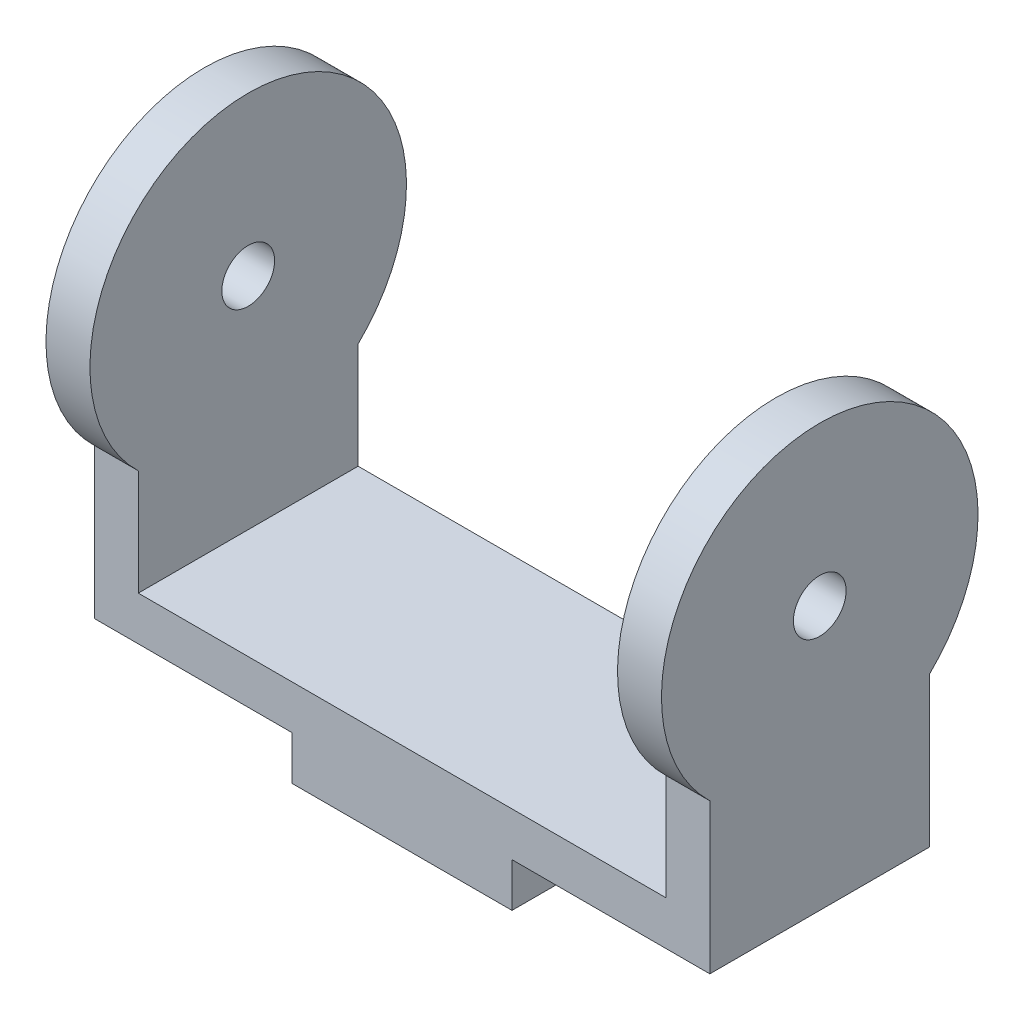
ISO-10303-21;
HEADER;
FILE_DESCRIPTION(('STEP AP214'),'2;1');
FILE_NAME('part.step','',(''),(''),'','','');
FILE_SCHEMA(('AUTOMOTIVE_DESIGN { 1 0 10303 214 1 1 1 1 }'));
ENDSEC;
DATA;
#1=APPLICATION_CONTEXT('core data for automotive mechanical design processes');
#2=APPLICATION_PROTOCOL_DEFINITION('international standard','automotive_design',2000,#1);
#3=PRODUCT_CONTEXT('',#1,'mechanical');
#4=PRODUCT('Part','Part','',(#3));
#5=PRODUCT_RELATED_PRODUCT_CATEGORY('part','',(#4));
#6=PRODUCT_DEFINITION_FORMATION('','',#4);
#7=PRODUCT_DEFINITION_CONTEXT('part definition',#1,'design');
#8=PRODUCT_DEFINITION('design','',#6,#7);
#9=PRODUCT_DEFINITION_SHAPE('','',#8);
#10=(LENGTH_UNIT() NAMED_UNIT(*) SI_UNIT(.MILLI.,.METRE.));
#11=(NAMED_UNIT(*) PLANE_ANGLE_UNIT() SI_UNIT($,.RADIAN.));
#12=(NAMED_UNIT(*) SI_UNIT($,.STERADIAN.) SOLID_ANGLE_UNIT());
#13=UNCERTAINTY_MEASURE_WITH_UNIT(LENGTH_MEASURE(1.E-05),#10,'distance_accuracy_value','');
#14=(GEOMETRIC_REPRESENTATION_CONTEXT(3) GLOBAL_UNCERTAINTY_ASSIGNED_CONTEXT((#13)) GLOBAL_UNIT_ASSIGNED_CONTEXT((#10,
#11,#12)) REPRESENTATION_CONTEXT('',''));
#15=CARTESIAN_POINT('',(0.,0.,0.));
#16=DIRECTION('',(0.,0.,1.));
#17=DIRECTION('',(1.,0.,0.));
#18=AXIS2_PLACEMENT_3D('',#15,#16,#17);
#19=CARTESIAN_POINT('',(0.,0.,0.));
#20=DIRECTION('',(0.,1.,0.));
#21=DIRECTION('',(0.,0.,1.));
#22=AXIS2_PLACEMENT_3D('',#19,#20,#21);
#23=PLANE('',#22);
#24=DIRECTION('',(0.,0.,1.));
#25=VECTOR('',#24,1.);
#26=CARTESIAN_POINT('',(12.5,0.,12.5));
#27=LINE('',#26,#25);
#28=CARTESIAN_POINT('',(12.5,0.,-12.5));
#29=VERTEX_POINT('',#28);
#30=CARTESIAN_POINT('',(12.5,0.,12.5));
#31=VERTEX_POINT('',#30);
#32=EDGE_CURVE('E49',#29,#31,#27,.T.);
#33=ORIENTED_EDGE('',*,*,#32,.F.);
#34=DIRECTION('',(-1.,0.,0.));
#35=VECTOR('',#34,1.);
#36=CARTESIAN_POINT('',(0.,0.,-12.5));
#37=LINE('',#36,#35);
#38=CARTESIAN_POINT('',(35.,0.,-12.5));
#39=VERTEX_POINT('',#38);
#40=EDGE_CURVE('E219',#39,#29,#37,.T.);
#41=ORIENTED_EDGE('',*,*,#40,.F.);
#42=DIRECTION('',(0.,0.,-1.));
#43=VECTOR('',#42,1.);
#44=CARTESIAN_POINT('',(35.,0.,-12.5));
#45=LINE('',#44,#43);
#46=CARTESIAN_POINT('',(35.,0.,12.5));
#47=VERTEX_POINT('',#46);
#48=EDGE_CURVE('E207',#47,#39,#45,.T.);
#49=ORIENTED_EDGE('',*,*,#48,.F.);
#50=DIRECTION('',(1.,0.,0.));
#51=VECTOR('',#50,1.);
#52=CARTESIAN_POINT('',(0.,0.,12.5));
#53=LINE('',#52,#51);
#54=EDGE_CURVE('E54',#31,#47,#53,.T.);
#55=ORIENTED_EDGE('',*,*,#54,.F.);
#56=EDGE_LOOP('',(#33,#41,#49,#55));
#57=FACE_BOUND('',#56,.T.);
#58=ADVANCED_FACE('F34',(#57),#23,.F.);
#59=DIRECTION('',(0.,0.,-1.));
#60=VECTOR('',#59,1.);
#61=CARTESIAN_POINT('',(-12.5,0.,12.5));
#62=LINE('',#61,#60);
#63=CARTESIAN_POINT('',(-12.5,0.,12.5));
#64=VERTEX_POINT('',#63);
#65=CARTESIAN_POINT('',(-12.5,0.,-12.5));
#66=VERTEX_POINT('',#65);
#67=EDGE_CURVE('E141',#64,#66,#62,.T.);
#68=ORIENTED_EDGE('',*,*,#67,.F.);
#69=CARTESIAN_POINT('',(-35.,0.,12.5));
#70=VERTEX_POINT('',#69);
#71=EDGE_CURVE('E214',#70,#64,#53,.T.);
#72=ORIENTED_EDGE('',*,*,#71,.F.);
#73=DIRECTION('',(0.,0.,-1.));
#74=VECTOR('',#73,1.);
#75=CARTESIAN_POINT('',(-35.,0.,-12.5));
#76=LINE('',#75,#74);
#77=CARTESIAN_POINT('',(-35.,0.,-12.5));
#78=VERTEX_POINT('',#77);
#79=EDGE_CURVE('E172',#70,#78,#76,.T.);
#80=ORIENTED_EDGE('',*,*,#79,.T.);
#81=EDGE_CURVE('E218',#66,#78,#37,.T.);
#82=ORIENTED_EDGE('',*,*,#81,.F.);
#83=EDGE_LOOP('',(#68,#72,#80,#82));
#84=FACE_BOUND('',#83,.T.);
#85=ADVANCED_FACE('F253',(#84),#23,.F.);
#86=CARTESIAN_POINT('',(0.,5.,0.));
#87=DIRECTION('',(0.,1.,0.));
#88=DIRECTION('',(0.,0.,1.));
#89=AXIS2_PLACEMENT_3D('',#86,#87,#88);
#90=PLANE('',#89);
#91=DIRECTION('',(-1.,0.,0.));
#92=VECTOR('',#91,1.);
#93=CARTESIAN_POINT('',(0.,5.,-12.5));
#94=LINE('',#93,#92);
#95=CARTESIAN_POINT('',(30.,5.,-12.5));
#96=VERTEX_POINT('',#95);
#97=CARTESIAN_POINT('',(-30.,5.,-12.5));
#98=VERTEX_POINT('',#97);
#99=EDGE_CURVE('E210',#96,#98,#94,.T.);
#100=ORIENTED_EDGE('',*,*,#99,.T.);
#101=DIRECTION('',(0.,0.,1.));
#102=VECTOR('',#101,1.);
#103=CARTESIAN_POINT('',(-30.,5.,0.));
#104=LINE('',#103,#102);
#105=CARTESIAN_POINT('',(-30.,5.,12.5));
#106=VERTEX_POINT('',#105);
#107=EDGE_CURVE('E160',#98,#106,#104,.T.);
#108=ORIENTED_EDGE('',*,*,#107,.T.);
#109=DIRECTION('',(1.,0.,0.));
#110=VECTOR('',#109,1.);
#111=CARTESIAN_POINT('',(0.,5.,12.5));
#112=LINE('',#111,#110);
#113=CARTESIAN_POINT('',(30.,5.,12.5));
#114=VERTEX_POINT('',#113);
#115=EDGE_CURVE('E213',#106,#114,#112,.T.);
#116=ORIENTED_EDGE('',*,*,#115,.T.);
#117=DIRECTION('',(0.,0.,1.));
#118=VECTOR('',#117,1.);
#119=CARTESIAN_POINT('',(30.,5.,0.));
#120=LINE('',#119,#118);
#121=EDGE_CURVE('E193',#96,#114,#120,.T.);
#122=ORIENTED_EDGE('',*,*,#121,.F.);
#123=EDGE_LOOP('',(#100,#108,#116,#122));
#124=FACE_BOUND('',#123,.T.);
#125=ADVANCED_FACE('F238',(#124),#90,.T.);
#126=CARTESIAN_POINT('',(35.,5.,-12.5));
#127=DIRECTION('',(-1.,0.,0.));
#128=DIRECTION('',(0.,0.,1.));
#129=AXIS2_PLACEMENT_3D('',#126,#127,#128);
#130=PLANE('',#129);
#131=ORIENTED_EDGE('',*,*,#48,.T.);
#132=DIRECTION('',(0.,-1.,0.));
#133=VECTOR('',#132,1.);
#134=CARTESIAN_POINT('',(35.,5.,-12.5));
#135=LINE('',#134,#133);
#136=CARTESIAN_POINT('',(35.,17.0481661530114,-12.5));
#137=VERTEX_POINT('',#136);
#138=EDGE_CURVE('E11',#137,#39,#135,.T.);
#139=ORIENTED_EDGE('',*,*,#138,.F.);
#140=CARTESIAN_POINT('',(35.,30.,0.));
#141=DIRECTION('',(1.,0.,0.));
#142=DIRECTION('',(0.,0.,-1.));
#143=AXIS2_PLACEMENT_3D('',#140,#141,#142);
#144=CIRCLE('',#143,18.);
#145=CARTESIAN_POINT('',(35.,17.0481661530114,12.5));
#146=VERTEX_POINT('',#145);
#147=EDGE_CURVE('E188',#137,#146,#144,.T.);
#148=ORIENTED_EDGE('',*,*,#147,.T.);
#149=DIRECTION('',(0.,-1.,0.));
#150=VECTOR('',#149,1.);
#151=CARTESIAN_POINT('',(35.,5.,12.5));
#152=LINE('',#151,#150);
#153=EDGE_CURVE('E42',#146,#47,#152,.T.);
#154=ORIENTED_EDGE('',*,*,#153,.T.);
#155=EDGE_LOOP('',(#131,#139,#148,#154));
#156=FACE_BOUND('',#155,.T.);
#157=CARTESIAN_POINT('',(35.,30.,0.));
#158=DIRECTION('',(1.,0.,0.));
#159=DIRECTION('',(0.,0.,-1.));
#160=AXIS2_PLACEMENT_3D('',#157,#158,#159);
#161=CIRCLE('',#160,3.);
#162=CARTESIAN_POINT('',(35.,30.,-3.));
#163=VERTEX_POINT('',#162);
#164=EDGE_CURVE('E183',#163,#163,#161,.T.);
#165=ORIENTED_EDGE('',*,*,#164,.F.);
#166=EDGE_LOOP('',(#165));
#167=FACE_BOUND('',#166,.T.);
#168=ADVANCED_FACE('F36',(#156,#167),#130,.F.);
#169=CARTESIAN_POINT('',(0.,5.,-12.5));
#170=DIRECTION('',(0.,0.,1.));
#171=DIRECTION('',(1.,0.,0.));
#172=AXIS2_PLACEMENT_3D('',#169,#170,#171);
#173=PLANE('',#172);
#174=ORIENTED_EDGE('',*,*,#40,.T.);
#175=DIRECTION('',(0.,1.,0.));
#176=VECTOR('',#175,1.);
#177=CARTESIAN_POINT('',(12.5,-5.,-12.5));
#178=LINE('',#177,#176);
#179=CARTESIAN_POINT('',(12.5,-5.,-12.5));
#180=VERTEX_POINT('',#179);
#181=EDGE_CURVE('E260',#180,#29,#178,.T.);
#182=ORIENTED_EDGE('',*,*,#181,.F.);
#183=DIRECTION('',(1.,0.,0.));
#184=VECTOR('',#183,1.);
#185=CARTESIAN_POINT('',(-12.5,-5.,-12.5));
#186=LINE('',#185,#184);
#187=CARTESIAN_POINT('',(-12.5,-5.,-12.5));
#188=VERTEX_POINT('',#187);
#189=EDGE_CURVE('E137',#188,#180,#186,.T.);
#190=ORIENTED_EDGE('',*,*,#189,.F.);
#191=DIRECTION('',(0.,1.,0.));
#192=VECTOR('',#191,1.);
#193=CARTESIAN_POINT('',(-12.5,-5.,-12.5));
#194=LINE('',#193,#192);
#195=EDGE_CURVE('E149',#188,#66,#194,.T.);
#196=ORIENTED_EDGE('',*,*,#195,.T.);
#197=ORIENTED_EDGE('',*,*,#81,.T.);
#198=DIRECTION('',(0.,-1.,0.));
#199=VECTOR('',#198,1.);
#200=CARTESIAN_POINT('',(-35.,5.,-12.5));
#201=LINE('',#200,#199);
#202=CARTESIAN_POINT('',(-35.,17.0481661530114,-12.5));
#203=VERTEX_POINT('',#202);
#204=EDGE_CURVE('E177',#203,#78,#201,.T.);
#205=ORIENTED_EDGE('',*,*,#204,.F.);
#206=DIRECTION('',(-1.,0.,0.));
#207=VECTOR('',#206,1.);
#208=CARTESIAN_POINT('',(-30.,17.0481661530114,-12.5));
#209=LINE('',#208,#207);
#210=CARTESIAN_POINT('',(-30.,17.0481661530114,-12.5));
#211=VERTEX_POINT('',#210);
#212=EDGE_CURVE('E165',#211,#203,#209,.T.);
#213=ORIENTED_EDGE('',*,*,#212,.F.);
#214=DIRECTION('',(0.,1.,0.));
#215=VECTOR('',#214,1.);
#216=CARTESIAN_POINT('',(-30.,0.,-12.5));
#217=LINE('',#216,#215);
#218=EDGE_CURVE('E158',#98,#211,#217,.T.);
#219=ORIENTED_EDGE('',*,*,#218,.F.);
#220=ORIENTED_EDGE('',*,*,#99,.F.);
#221=DIRECTION('',(0.,1.,0.));
#222=VECTOR('',#221,1.);
#223=CARTESIAN_POINT('',(30.,0.,-12.5));
#224=LINE('',#223,#222);
#225=CARTESIAN_POINT('',(30.,17.0481661530114,-12.5));
#226=VERTEX_POINT('',#225);
#227=EDGE_CURVE('E196',#96,#226,#224,.T.);
#228=ORIENTED_EDGE('',*,*,#227,.T.);
#229=DIRECTION('',(1.,0.,0.));
#230=VECTOR('',#229,1.);
#231=CARTESIAN_POINT('',(30.,17.0481661530114,-12.5));
#232=LINE('',#231,#230);
#233=EDGE_CURVE('E204',#226,#137,#232,.T.);
#234=ORIENTED_EDGE('',*,*,#233,.T.);
#235=ORIENTED_EDGE('',*,*,#138,.T.);
#236=EDGE_LOOP('',(#174,#182,#190,#196,#197,#205,#213,#219,#220,#228,#234,#235));
#237=FACE_BOUND('',#236,.T.);
#238=ADVANCED_FACE('F227',(#237),#173,.F.);
#239=CARTESIAN_POINT('',(0.,5.,12.5));
#240=DIRECTION('',(0.,0.,-1.));
#241=DIRECTION('',(-1.,0.,0.));
#242=AXIS2_PLACEMENT_3D('',#239,#240,#241);
#243=PLANE('',#242);
#244=ORIENTED_EDGE('',*,*,#71,.T.);
#245=DIRECTION('',(0.,1.,0.));
#246=VECTOR('',#245,1.);
#247=CARTESIAN_POINT('',(-12.5,-5.,12.5));
#248=LINE('',#247,#246);
#249=CARTESIAN_POINT('',(-12.5,-5.,12.5));
#250=VERTEX_POINT('',#249);
#251=EDGE_CURVE('E128',#250,#64,#248,.T.);
#252=ORIENTED_EDGE('',*,*,#251,.F.);
#253=DIRECTION('',(-1.,0.,0.));
#254=VECTOR('',#253,1.);
#255=CARTESIAN_POINT('',(-12.5,-5.,12.5));
#256=LINE('',#255,#254);
#257=CARTESIAN_POINT('',(12.5,-5.,12.5));
#258=VERTEX_POINT('',#257);
#259=EDGE_CURVE('E121',#258,#250,#256,.T.);
#260=ORIENTED_EDGE('',*,*,#259,.F.);
#261=DIRECTION('',(0.,1.,0.));
#262=VECTOR('',#261,1.);
#263=CARTESIAN_POINT('',(12.5,-5.,12.5));
#264=LINE('',#263,#262);
#265=EDGE_CURVE('E126',#258,#31,#264,.T.);
#266=ORIENTED_EDGE('',*,*,#265,.T.);
#267=ORIENTED_EDGE('',*,*,#54,.T.);
#268=ORIENTED_EDGE('',*,*,#153,.F.);
#269=DIRECTION('',(1.,0.,0.));
#270=VECTOR('',#269,1.);
#271=CARTESIAN_POINT('',(30.,17.0481661530114,12.5));
#272=LINE('',#271,#270);
#273=CARTESIAN_POINT('',(30.,17.0481661530114,12.5));
#274=VERTEX_POINT('',#273);
#275=EDGE_CURVE('E199',#274,#146,#272,.T.);
#276=ORIENTED_EDGE('',*,*,#275,.F.);
#277=DIRECTION('',(0.,1.,0.));
#278=VECTOR('',#277,1.);
#279=CARTESIAN_POINT('',(30.,0.,12.5));
#280=LINE('',#279,#278);
#281=EDGE_CURVE('E191',#114,#274,#280,.T.);
#282=ORIENTED_EDGE('',*,*,#281,.F.);
#283=ORIENTED_EDGE('',*,*,#115,.F.);
#284=DIRECTION('',(0.,1.,0.));
#285=VECTOR('',#284,1.);
#286=CARTESIAN_POINT('',(-30.,0.,12.5));
#287=LINE('',#286,#285);
#288=CARTESIAN_POINT('',(-30.,17.0481661530114,12.5));
#289=VERTEX_POINT('',#288);
#290=EDGE_CURVE('E163',#106,#289,#287,.T.);
#291=ORIENTED_EDGE('',*,*,#290,.T.);
#292=DIRECTION('',(-1.,0.,0.));
#293=VECTOR('',#292,1.);
#294=CARTESIAN_POINT('',(-30.,17.0481661530114,12.5));
#295=LINE('',#294,#293);
#296=CARTESIAN_POINT('',(-35.,17.0481661530114,12.5));
#297=VERTEX_POINT('',#296);
#298=EDGE_CURVE('E169',#289,#297,#295,.T.);
#299=ORIENTED_EDGE('',*,*,#298,.T.);
#300=DIRECTION('',(0.,-1.,0.));
#301=VECTOR('',#300,1.);
#302=CARTESIAN_POINT('',(-35.,5.,12.5));
#303=LINE('',#302,#301);
#304=EDGE_CURVE('E180',#297,#70,#303,.T.);
#305=ORIENTED_EDGE('',*,*,#304,.T.);
#306=EDGE_LOOP('',(#244,#252,#260,#266,#267,#268,#276,#282,#283,#291,#299,#305));
#307=FACE_BOUND('',#306,.T.);
#308=ADVANCED_FACE('F124',(#307),#243,.F.);
#309=CARTESIAN_POINT('',(30.,30.,0.));
#310=DIRECTION('',(1.,0.,0.));
#311=DIRECTION('',(0.,0.,-1.));
#312=AXIS2_PLACEMENT_3D('',#309,#310,#311);
#313=CYLINDRICAL_SURFACE('',#312,18.);
#314=ORIENTED_EDGE('',*,*,#147,.F.);
#315=ORIENTED_EDGE('',*,*,#233,.F.);
#316=CARTESIAN_POINT('',(30.,30.,0.));
#317=DIRECTION('',(1.,0.,0.));
#318=DIRECTION('',(0.,0.,-1.));
#319=AXIS2_PLACEMENT_3D('',#316,#317,#318);
#320=CIRCLE('',#319,18.);
#321=EDGE_CURVE('E187',#226,#274,#320,.T.);
#322=ORIENTED_EDGE('',*,*,#321,.T.);
#323=ORIENTED_EDGE('',*,*,#275,.T.);
#324=EDGE_LOOP('',(#314,#315,#322,#323));
#325=FACE_BOUND('',#324,.T.);
#326=ADVANCED_FACE('F232',(#325),#313,.T.);
#327=CARTESIAN_POINT('',(30.,30.,0.));
#328=DIRECTION('',(1.,0.,0.));
#329=DIRECTION('',(0.,0.,-1.));
#330=AXIS2_PLACEMENT_3D('',#327,#328,#329);
#331=CYLINDRICAL_SURFACE('',#330,3.);
#332=CARTESIAN_POINT('',(30.,30.,0.));
#333=DIRECTION('',(1.,0.,0.));
#334=DIRECTION('',(0.,0.,-1.));
#335=AXIS2_PLACEMENT_3D('',#332,#333,#334);
#336=CIRCLE('',#335,3.);
#337=CARTESIAN_POINT('',(30.,30.,-3.));
#338=VERTEX_POINT('',#337);
#339=EDGE_CURVE('E184',#338,#338,#336,.T.);
#340=ORIENTED_EDGE('',*,*,#339,.F.);
#341=EDGE_LOOP('',(#340));
#342=FACE_BOUND('',#341,.T.);
#343=ORIENTED_EDGE('',*,*,#164,.T.);
#344=EDGE_LOOP('',(#343));
#345=FACE_BOUND('',#344,.T.);
#346=ADVANCED_FACE('F363',(#342,#345),#331,.F.);
#347=CARTESIAN_POINT('',(30.,0.,0.));
#348=DIRECTION('',(1.,0.,0.));
#349=DIRECTION('',(0.,0.,-1.));
#350=AXIS2_PLACEMENT_3D('',#347,#348,#349);
#351=PLANE('',#350);
#352=ORIENTED_EDGE('',*,*,#339,.T.);
#353=EDGE_LOOP('',(#352));
#354=FACE_BOUND('',#353,.T.);
#355=ORIENTED_EDGE('',*,*,#321,.F.);
#356=ORIENTED_EDGE('',*,*,#227,.F.);
#357=ORIENTED_EDGE('',*,*,#121,.T.);
#358=ORIENTED_EDGE('',*,*,#281,.T.);
#359=EDGE_LOOP('',(#355,#356,#357,#358));
#360=FACE_BOUND('',#359,.T.);
#361=ADVANCED_FACE('F236',(#354,#360),#351,.F.);
#362=CARTESIAN_POINT('',(-35.,5.,-12.5));
#363=DIRECTION('',(-1.,0.,0.));
#364=DIRECTION('',(0.,0.,1.));
#365=AXIS2_PLACEMENT_3D('',#362,#363,#364);
#366=PLANE('',#365);
#367=ORIENTED_EDGE('',*,*,#79,.F.);
#368=ORIENTED_EDGE('',*,*,#304,.F.);
#369=CARTESIAN_POINT('',(-35.,30.,0.));
#370=DIRECTION('',(1.,0.,0.));
#371=DIRECTION('',(0.,0.,-1.));
#372=AXIS2_PLACEMENT_3D('',#369,#370,#371);
#373=CIRCLE('',#372,18.);
#374=EDGE_CURVE('E147',#203,#297,#373,.T.);
#375=ORIENTED_EDGE('',*,*,#374,.F.);
#376=ORIENTED_EDGE('',*,*,#204,.T.);
#377=EDGE_LOOP('',(#367,#368,#375,#376));
#378=FACE_BOUND('',#377,.T.);
#379=CARTESIAN_POINT('',(-35.,30.,0.));
#380=DIRECTION('',(1.,0.,0.));
#381=DIRECTION('',(0.,0.,-1.));
#382=AXIS2_PLACEMENT_3D('',#379,#380,#381);
#383=CIRCLE('',#382,3.);
#384=CARTESIAN_POINT('',(-35.,30.,-2.99999999999999));
#385=VERTEX_POINT('',#384);
#386=EDGE_CURVE('E144',#385,#385,#383,.T.);
#387=ORIENTED_EDGE('',*,*,#386,.T.);
#388=EDGE_LOOP('',(#387));
#389=FACE_BOUND('',#388,.T.);
#390=ADVANCED_FACE('F250',(#378,#389),#366,.T.);
#391=CARTESIAN_POINT('',(-30.,30.,0.));
#392=DIRECTION('',(-1.,0.,0.));
#393=DIRECTION('',(0.,0.,1.));
#394=AXIS2_PLACEMENT_3D('',#391,#392,#393);
#395=CYLINDRICAL_SURFACE('',#394,18.);
#396=ORIENTED_EDGE('',*,*,#374,.T.);
#397=ORIENTED_EDGE('',*,*,#298,.F.);
#398=CARTESIAN_POINT('',(-30.,30.,0.));
#399=DIRECTION('',(1.,0.,0.));
#400=DIRECTION('',(0.,0.,-1.));
#401=AXIS2_PLACEMENT_3D('',#398,#399,#400);
#402=CIRCLE('',#401,18.);
#403=EDGE_CURVE('E156',#211,#289,#402,.T.);
#404=ORIENTED_EDGE('',*,*,#403,.F.);
#405=ORIENTED_EDGE('',*,*,#212,.T.);
#406=EDGE_LOOP('',(#396,#397,#404,#405));
#407=FACE_BOUND('',#406,.T.);
#408=ADVANCED_FACE('F248',(#407),#395,.T.);
#409=CARTESIAN_POINT('',(-30.,30.,0.));
#410=DIRECTION('',(-1.,0.,0.));
#411=DIRECTION('',(0.,0.,1.));
#412=AXIS2_PLACEMENT_3D('',#409,#410,#411);
#413=CYLINDRICAL_SURFACE('',#412,3.);
#414=CARTESIAN_POINT('',(-30.,30.,0.));
#415=DIRECTION('',(1.,0.,0.));
#416=DIRECTION('',(0.,0.,-1.));
#417=AXIS2_PLACEMENT_3D('',#414,#415,#416);
#418=CIRCLE('',#417,3.);
#419=CARTESIAN_POINT('',(-30.,30.,-2.99999999999999));
#420=VERTEX_POINT('',#419);
#421=EDGE_CURVE('E153',#420,#420,#418,.T.);
#422=ORIENTED_EDGE('',*,*,#421,.T.);
#423=EDGE_LOOP('',(#422));
#424=FACE_BOUND('',#423,.T.);
#425=ORIENTED_EDGE('',*,*,#386,.F.);
#426=EDGE_LOOP('',(#425));
#427=FACE_BOUND('',#426,.T.);
#428=ADVANCED_FACE('F338',(#424,#427),#413,.F.);
#429=CARTESIAN_POINT('',(-30.,0.,0.));
#430=DIRECTION('',(-1.,0.,0.));
#431=DIRECTION('',(0.,0.,-1.));
#432=AXIS2_PLACEMENT_3D('',#429,#430,#431);
#433=PLANE('',#432);
#434=ORIENTED_EDGE('',*,*,#421,.F.);
#435=EDGE_LOOP('',(#434));
#436=FACE_BOUND('',#435,.T.);
#437=ORIENTED_EDGE('',*,*,#403,.T.);
#438=ORIENTED_EDGE('',*,*,#290,.F.);
#439=ORIENTED_EDGE('',*,*,#107,.F.);
#440=ORIENTED_EDGE('',*,*,#218,.T.);
#441=EDGE_LOOP('',(#437,#438,#439,#440));
#442=FACE_BOUND('',#441,.T.);
#443=ADVANCED_FACE('F243',(#436,#442),#433,.F.);
#444=CARTESIAN_POINT('',(12.5,-5.,12.5));
#445=DIRECTION('',(-1.,0.,0.));
#446=DIRECTION('',(0.,0.,1.));
#447=AXIS2_PLACEMENT_3D('',#444,#445,#446);
#448=PLANE('',#447);
#449=ORIENTED_EDGE('',*,*,#32,.T.);
#450=ORIENTED_EDGE('',*,*,#265,.F.);
#451=DIRECTION('',(0.,0.,1.));
#452=VECTOR('',#451,1.);
#453=CARTESIAN_POINT('',(12.5,-5.,12.5));
#454=LINE('',#453,#452);
#455=EDGE_CURVE('E132',#180,#258,#454,.T.);
#456=ORIENTED_EDGE('',*,*,#455,.F.);
#457=ORIENTED_EDGE('',*,*,#181,.T.);
#458=EDGE_LOOP('',(#449,#450,#456,#457));
#459=FACE_BOUND('',#458,.T.);
#460=ADVANCED_FACE('F143',(#459),#448,.F.);
#461=CARTESIAN_POINT('',(-12.5,-5.,12.5));
#462=DIRECTION('',(1.,0.,0.));
#463=DIRECTION('',(0.,0.,-1.));
#464=AXIS2_PLACEMENT_3D('',#461,#462,#463);
#465=PLANE('',#464);
#466=ORIENTED_EDGE('',*,*,#67,.T.);
#467=ORIENTED_EDGE('',*,*,#195,.F.);
#468=DIRECTION('',(0.,0.,-1.));
#469=VECTOR('',#468,1.);
#470=CARTESIAN_POINT('',(-12.5,-5.,12.5));
#471=LINE('',#470,#469);
#472=EDGE_CURVE('E131',#250,#188,#471,.T.);
#473=ORIENTED_EDGE('',*,*,#472,.F.);
#474=ORIENTED_EDGE('',*,*,#251,.T.);
#475=EDGE_LOOP('',(#466,#467,#473,#474));
#476=FACE_BOUND('',#475,.T.);
#477=ADVANCED_FACE('F256',(#476),#465,.F.);
#478=CARTESIAN_POINT('',(0.,-5.,0.));
#479=DIRECTION('',(0.,-1.,0.));
#480=DIRECTION('',(0.,0.,-1.));
#481=AXIS2_PLACEMENT_3D('',#478,#479,#480);
#482=PLANE('',#481);
#483=ORIENTED_EDGE('',*,*,#455,.T.);
#484=ORIENTED_EDGE('',*,*,#259,.T.);
#485=ORIENTED_EDGE('',*,*,#472,.T.);
#486=ORIENTED_EDGE('',*,*,#189,.T.);
#487=EDGE_LOOP('',(#483,#484,#485,#486));
#488=FACE_BOUND('',#487,.T.);
#489=ADVANCED_FACE('F135',(#488),#482,.T.);
#490=CLOSED_SHELL('',(#58,#85,#125,#168,#238,#308,#326,#346,#361,#390,#408,#428,#443,#460,#477,#489));
#491=MANIFOLD_SOLID_BREP('B2',#490);
#492=ADVANCED_BREP_SHAPE_REPRESENTATION('',(#18,#491),#14);
#493=SHAPE_DEFINITION_REPRESENTATION(#9,#492);
ENDSEC;
END-ISO-10303-21;
